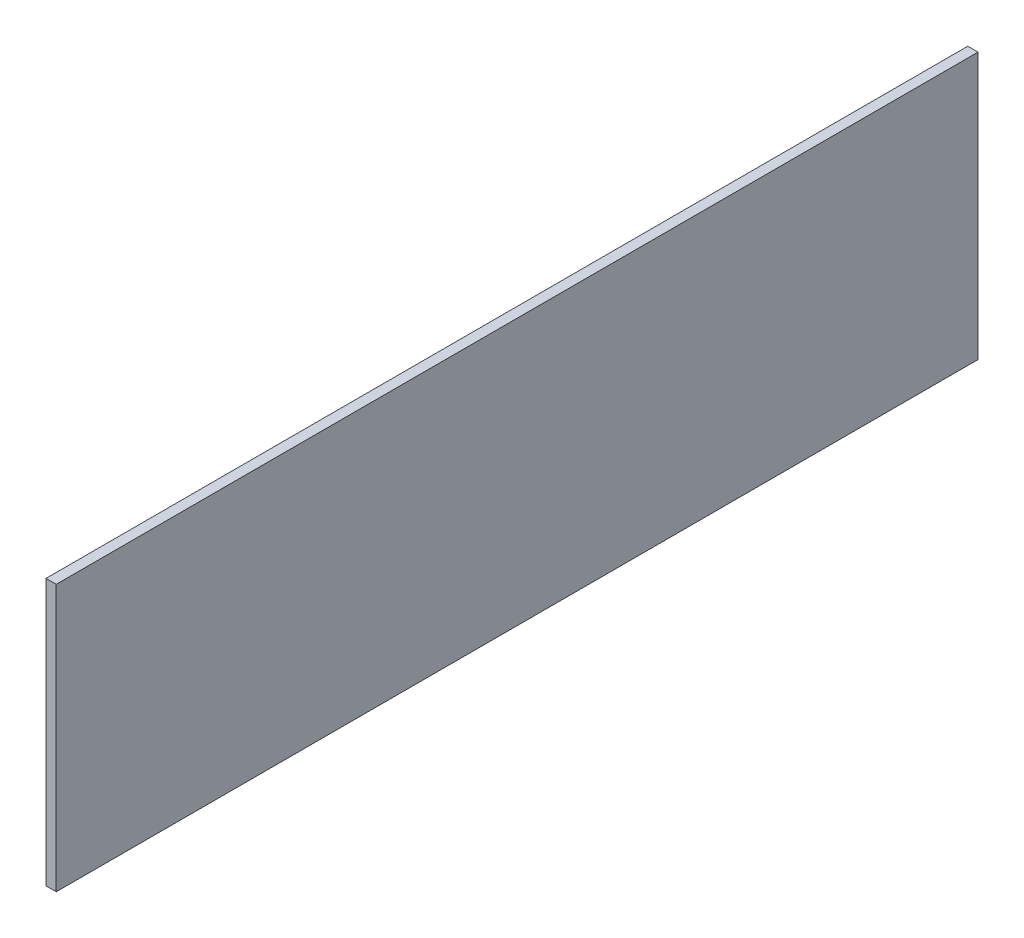
ISO-10303-21;
HEADER;
FILE_DESCRIPTION(('STEP AP214'),'2;1');
FILE_NAME('part.step','',(''),(''),'','','');
FILE_SCHEMA(('AUTOMOTIVE_DESIGN { 1 0 10303 214 1 1 1 1 }'));
ENDSEC;
DATA;
#1=APPLICATION_CONTEXT('core data for automotive mechanical design processes');
#2=APPLICATION_PROTOCOL_DEFINITION('international standard','automotive_design',2000,#1);
#3=PRODUCT_CONTEXT('',#1,'mechanical');
#4=PRODUCT('Part','Part','',(#3));
#5=PRODUCT_RELATED_PRODUCT_CATEGORY('part','',(#4));
#6=PRODUCT_DEFINITION_FORMATION('','',#4);
#7=PRODUCT_DEFINITION_CONTEXT('part definition',#1,'design');
#8=PRODUCT_DEFINITION('design','',#6,#7);
#9=PRODUCT_DEFINITION_SHAPE('','',#8);
#10=(LENGTH_UNIT() NAMED_UNIT(*) SI_UNIT(.MILLI.,.METRE.));
#11=(NAMED_UNIT(*) PLANE_ANGLE_UNIT() SI_UNIT($,.RADIAN.));
#12=(NAMED_UNIT(*) SI_UNIT($,.STERADIAN.) SOLID_ANGLE_UNIT());
#13=UNCERTAINTY_MEASURE_WITH_UNIT(LENGTH_MEASURE(1.E-05),#10,'distance_accuracy_value','');
#14=(GEOMETRIC_REPRESENTATION_CONTEXT(3) GLOBAL_UNCERTAINTY_ASSIGNED_CONTEXT((#13)) GLOBAL_UNIT_ASSIGNED_CONTEXT((#10,
#11,#12)) REPRESENTATION_CONTEXT('',''));
#15=CARTESIAN_POINT('',(0.,0.,0.));
#16=DIRECTION('',(0.,0.,1.));
#17=DIRECTION('',(1.,0.,0.));
#18=AXIS2_PLACEMENT_3D('',#15,#16,#17);
#19=CARTESIAN_POINT('',(-10.,2.22044604925031E-13,900.));
#20=DIRECTION('',(0.,-1.,0.));
#21=DIRECTION('',(0.,0.,-1.));
#22=AXIS2_PLACEMENT_3D('',#19,#20,#21);
#23=PLANE('',#22);
#24=DIRECTION('',(1.,0.,0.));
#25=VECTOR('',#24,1.);
#26=CARTESIAN_POINT('',(-10.,2.22044604925031E-13,-900.));
#27=LINE('',#26,#25);
#28=CARTESIAN_POINT('',(-10.,2.22044604925031E-13,-900.));
#29=VERTEX_POINT('',#28);
#30=CARTESIAN_POINT('',(10.,2.22044604925031E-13,-900.));
#31=VERTEX_POINT('',#30);
#32=EDGE_CURVE('E44',#29,#31,#27,.T.);
#33=ORIENTED_EDGE('',*,*,#32,.T.);
#34=DIRECTION('',(0.,0.,-1.));
#35=VECTOR('',#34,1.);
#36=CARTESIAN_POINT('',(10.,2.22044604925031E-13,900.));
#37=LINE('',#36,#35);
#38=CARTESIAN_POINT('',(10.,2.22044604925031E-13,900.));
#39=VERTEX_POINT('',#38);
#40=EDGE_CURVE('E81',#39,#31,#37,.T.);
#41=ORIENTED_EDGE('',*,*,#40,.F.);
#42=DIRECTION('',(1.,0.,0.));
#43=VECTOR('',#42,1.);
#44=CARTESIAN_POINT('',(-10.,2.22044604925031E-13,900.));
#45=LINE('',#44,#43);
#46=CARTESIAN_POINT('',(-10.,2.22044604925031E-13,900.));
#47=VERTEX_POINT('',#46);
#48=EDGE_CURVE('E11',#47,#39,#45,.T.);
#49=ORIENTED_EDGE('',*,*,#48,.F.);
#50=DIRECTION('',(0.,0.,-1.));
#51=VECTOR('',#50,1.);
#52=CARTESIAN_POINT('',(-10.,2.22044604925031E-13,900.));
#53=LINE('',#52,#51);
#54=EDGE_CURVE('E82',#47,#29,#53,.T.);
#55=ORIENTED_EDGE('',*,*,#54,.T.);
#56=EDGE_LOOP('',(#33,#41,#49,#55));
#57=FACE_BOUND('',#56,.T.);
#58=ADVANCED_FACE('F41',(#57),#23,.T.);
#59=CARTESIAN_POINT('',(-10.,2.22044604925031E-13,900.));
#60=DIRECTION('',(0.,0.,1.));
#61=DIRECTION('',(1.,0.,0.));
#62=AXIS2_PLACEMENT_3D('',#59,#60,#61);
#63=PLANE('',#62);
#64=ORIENTED_EDGE('',*,*,#48,.T.);
#65=DIRECTION('',(0.,-1.,0.));
#66=VECTOR('',#65,1.);
#67=CARTESIAN_POINT('',(10.,2.22044604925031E-13,900.));
#68=LINE('',#67,#66);
#69=CARTESIAN_POINT('',(10.,520.,900.));
#70=VERTEX_POINT('',#69);
#71=EDGE_CURVE('E98',#70,#39,#68,.T.);
#72=ORIENTED_EDGE('',*,*,#71,.F.);
#73=DIRECTION('',(1.,0.,0.));
#74=VECTOR('',#73,1.);
#75=CARTESIAN_POINT('',(-10.,520.,900.));
#76=LINE('',#75,#74);
#77=CARTESIAN_POINT('',(-10.,520.,900.));
#78=VERTEX_POINT('',#77);
#79=EDGE_CURVE('E49',#78,#70,#76,.T.);
#80=ORIENTED_EDGE('',*,*,#79,.F.);
#81=DIRECTION('',(0.,-1.,0.));
#82=VECTOR('',#81,1.);
#83=CARTESIAN_POINT('',(-10.,2.22044604925031E-13,900.));
#84=LINE('',#83,#82);
#85=EDGE_CURVE('E87',#78,#47,#84,.T.);
#86=ORIENTED_EDGE('',*,*,#85,.T.);
#87=EDGE_LOOP('',(#64,#72,#80,#86));
#88=FACE_BOUND('',#87,.T.);
#89=ADVANCED_FACE('F113',(#88),#63,.T.);
#90=CARTESIAN_POINT('',(-10.,520.,900.));
#91=DIRECTION('',(0.,1.,0.));
#92=DIRECTION('',(0.,0.,1.));
#93=AXIS2_PLACEMENT_3D('',#90,#91,#92);
#94=PLANE('',#93);
#95=ORIENTED_EDGE('',*,*,#79,.T.);
#96=DIRECTION('',(0.,0.,1.));
#97=VECTOR('',#96,1.);
#98=CARTESIAN_POINT('',(10.,520.,900.));
#99=LINE('',#98,#97);
#100=CARTESIAN_POINT('',(10.,520.,-900.));
#101=VERTEX_POINT('',#100);
#102=EDGE_CURVE('E94',#101,#70,#99,.T.);
#103=ORIENTED_EDGE('',*,*,#102,.F.);
#104=DIRECTION('',(1.,0.,0.));
#105=VECTOR('',#104,1.);
#106=CARTESIAN_POINT('',(-10.,520.,-900.));
#107=LINE('',#106,#105);
#108=CARTESIAN_POINT('',(-10.,520.,-900.));
#109=VERTEX_POINT('',#108);
#110=EDGE_CURVE('E86',#109,#101,#107,.T.);
#111=ORIENTED_EDGE('',*,*,#110,.F.);
#112=DIRECTION('',(0.,0.,1.));
#113=VECTOR('',#112,1.);
#114=CARTESIAN_POINT('',(-10.,520.,900.));
#115=LINE('',#114,#113);
#116=EDGE_CURVE('E106',#109,#78,#115,.T.);
#117=ORIENTED_EDGE('',*,*,#116,.T.);
#118=EDGE_LOOP('',(#95,#103,#111,#117));
#119=FACE_BOUND('',#118,.T.);
#120=ADVANCED_FACE('F110',(#119),#94,.T.);
#121=CARTESIAN_POINT('',(-10.,2.22044604925031E-13,-900.));
#122=DIRECTION('',(0.,0.,-1.));
#123=DIRECTION('',(-1.,0.,0.));
#124=AXIS2_PLACEMENT_3D('',#121,#122,#123);
#125=PLANE('',#124);
#126=ORIENTED_EDGE('',*,*,#110,.T.);
#127=DIRECTION('',(0.,1.,0.));
#128=VECTOR('',#127,1.);
#129=CARTESIAN_POINT('',(10.,2.22044604925031E-13,-900.));
#130=LINE('',#129,#128);
#131=EDGE_CURVE('E89',#31,#101,#130,.T.);
#132=ORIENTED_EDGE('',*,*,#131,.F.);
#133=ORIENTED_EDGE('',*,*,#32,.F.);
#134=DIRECTION('',(0.,1.,0.));
#135=VECTOR('',#134,1.);
#136=CARTESIAN_POINT('',(-10.,2.22044604925031E-13,-900.));
#137=LINE('',#136,#135);
#138=EDGE_CURVE('E104',#29,#109,#137,.T.);
#139=ORIENTED_EDGE('',*,*,#138,.T.);
#140=EDGE_LOOP('',(#126,#132,#133,#139));
#141=FACE_BOUND('',#140,.T.);
#142=ADVANCED_FACE('F90',(#141),#125,.T.);
#143=CARTESIAN_POINT('',(-10.,0.,0.));
#144=DIRECTION('',(1.,0.,0.));
#145=DIRECTION('',(0.,0.,-1.));
#146=AXIS2_PLACEMENT_3D('',#143,#144,#145);
#147=PLANE('',#146);
#148=ORIENTED_EDGE('',*,*,#54,.F.);
#149=ORIENTED_EDGE('',*,*,#85,.F.);
#150=ORIENTED_EDGE('',*,*,#116,.F.);
#151=ORIENTED_EDGE('',*,*,#138,.F.);
#152=EDGE_LOOP('',(#148,#149,#150,#151));
#153=FACE_BOUND('',#152,.T.);
#154=ADVANCED_FACE('F115',(#153),#147,.F.);
#155=CARTESIAN_POINT('',(10.,0.,0.));
#156=DIRECTION('',(1.,0.,0.));
#157=DIRECTION('',(0.,0.,-1.));
#158=AXIS2_PLACEMENT_3D('',#155,#156,#157);
#159=PLANE('',#158);
#160=ORIENTED_EDGE('',*,*,#40,.T.);
#161=ORIENTED_EDGE('',*,*,#131,.T.);
#162=ORIENTED_EDGE('',*,*,#102,.T.);
#163=ORIENTED_EDGE('',*,*,#71,.T.);
#164=EDGE_LOOP('',(#160,#161,#162,#163));
#165=FACE_BOUND('',#164,.T.);
#166=ADVANCED_FACE('F97',(#165),#159,.T.);
#167=CLOSED_SHELL('',(#58,#89,#120,#142,#154,#166));
#168=MANIFOLD_SOLID_BREP('B2',#167);
#169=ADVANCED_BREP_SHAPE_REPRESENTATION('',(#18,#168),#14);
#170=SHAPE_DEFINITION_REPRESENTATION(#9,#169);
ENDSEC;
END-ISO-10303-21;
